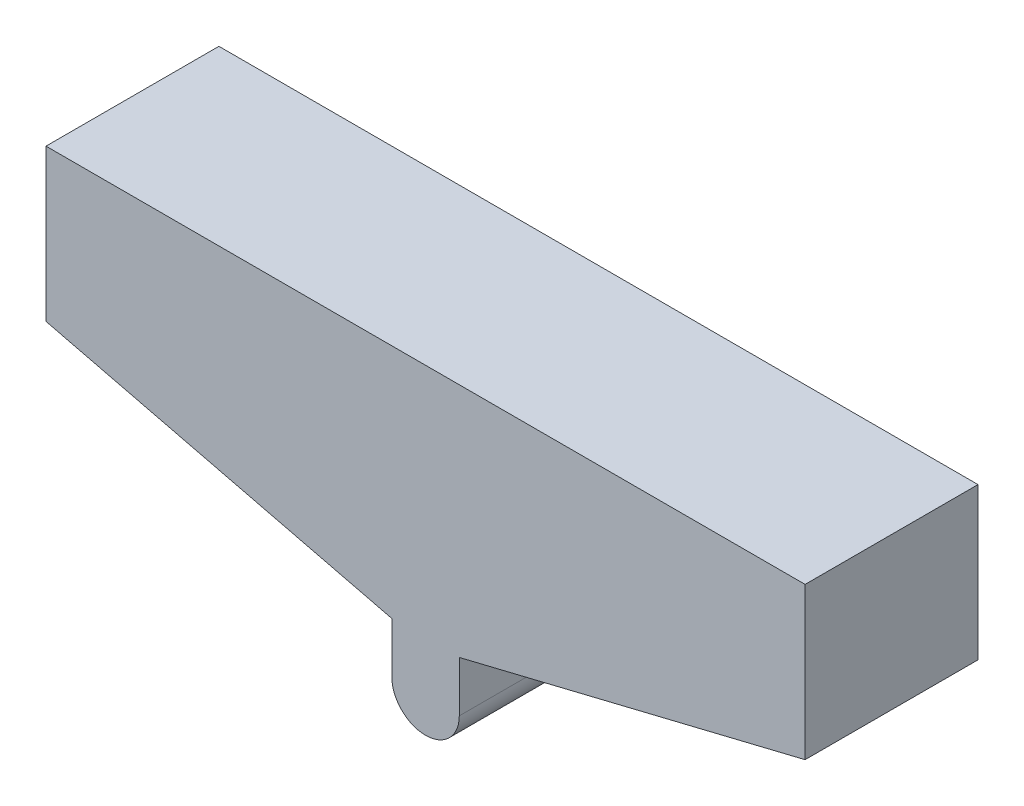
ISO-10303-21;
HEADER;
FILE_DESCRIPTION(('STEP AP214'),'2;1');
FILE_NAME('part.step','',(''),(''),'','','');
FILE_SCHEMA(('AUTOMOTIVE_DESIGN { 1 0 10303 214 1 1 1 1 }'));
ENDSEC;
DATA;
#1=APPLICATION_CONTEXT('core data for automotive mechanical design processes');
#2=APPLICATION_PROTOCOL_DEFINITION('international standard','automotive_design',2000,#1);
#3=PRODUCT_CONTEXT('',#1,'mechanical');
#4=PRODUCT('Part','Part','',(#3));
#5=PRODUCT_RELATED_PRODUCT_CATEGORY('part','',(#4));
#6=PRODUCT_DEFINITION_FORMATION('','',#4);
#7=PRODUCT_DEFINITION_CONTEXT('part definition',#1,'design');
#8=PRODUCT_DEFINITION('design','',#6,#7);
#9=PRODUCT_DEFINITION_SHAPE('','',#8);
#10=(LENGTH_UNIT() NAMED_UNIT(*) SI_UNIT(.MILLI.,.METRE.));
#11=(NAMED_UNIT(*) PLANE_ANGLE_UNIT() SI_UNIT($,.RADIAN.));
#12=(NAMED_UNIT(*) SI_UNIT($,.STERADIAN.) SOLID_ANGLE_UNIT());
#13=UNCERTAINTY_MEASURE_WITH_UNIT(LENGTH_MEASURE(1.E-05),#10,'distance_accuracy_value','');
#14=(GEOMETRIC_REPRESENTATION_CONTEXT(3) GLOBAL_UNCERTAINTY_ASSIGNED_CONTEXT((#13)) GLOBAL_UNIT_ASSIGNED_CONTEXT((#10,
#11,#12)) REPRESENTATION_CONTEXT('',''));
#15=CARTESIAN_POINT('',(0.,0.,0.));
#16=DIRECTION('',(0.,0.,1.));
#17=DIRECTION('',(1.,0.,0.));
#18=AXIS2_PLACEMENT_3D('',#15,#16,#17);
#19=CARTESIAN_POINT('',(0.,0.,0.));
#20=DIRECTION('',(0.,0.,1.));
#21=DIRECTION('',(1.,0.,0.));
#22=AXIS2_PLACEMENT_3D('',#19,#20,#21);
#23=PLANE('',#22);
#24=DIRECTION('',(0.,-1.,0.));
#25=VECTOR('',#24,1.);
#26=CARTESIAN_POINT('',(4.,0.,0.));
#27=LINE('',#26,#25);
#28=CARTESIAN_POINT('',(4.,-9.,0.));
#29=VERTEX_POINT('',#28);
#30=CARTESIAN_POINT('',(4.00000000000001,-19.,0.));
#31=VERTEX_POINT('',#30);
#32=EDGE_CURVE('E210',#29,#31,#27,.T.);
#33=ORIENTED_EDGE('',*,*,#32,.F.);
#34=DIRECTION('',(1.,0.,0.));
#35=VECTOR('',#34,1.);
#36=CARTESIAN_POINT('',(0.,-9.,0.));
#37=LINE('',#36,#35);
#38=CARTESIAN_POINT('',(45.,-9.,0.));
#39=VERTEX_POINT('',#38);
#40=EDGE_CURVE('E206',#29,#39,#37,.T.);
#41=ORIENTED_EDGE('',*,*,#40,.T.);
#42=DIRECTION('',(-0.97152033878313,-0.236956180191007,0.));
#43=VECTOR('',#42,1.);
#44=CARTESIAN_POINT('',(4.5985401459854,-18.8540145985401,0.));
#45=LINE('',#44,#43);
#46=EDGE_CURVE('E294',#39,#31,#45,.T.);
#47=ORIENTED_EDGE('',*,*,#46,.T.);
#48=EDGE_LOOP('',(#33,#41,#47));
#49=FACE_BOUND('',#48,.T.);
#50=ADVANCED_FACE('F41',(#49),#23,.F.);
#51=CARTESIAN_POINT('',(4.,0.,14.));
#52=DIRECTION('',(1.,0.,0.));
#53=DIRECTION('',(0.,1.,0.));
#54=AXIS2_PLACEMENT_3D('',#51,#52,#53);
#55=PLANE('',#54);
#56=DIRECTION('',(0.,-1.,0.));
#57=VECTOR('',#56,1.);
#58=CARTESIAN_POINT('',(4.,0.,14.));
#59=LINE('',#58,#57);
#60=CARTESIAN_POINT('',(4.00000000000001,-19.,14.));
#61=VERTEX_POINT('',#60);
#62=CARTESIAN_POINT('',(4.00000000000001,-25.,14.));
#63=VERTEX_POINT('',#62);
#64=EDGE_CURVE('E325',#61,#63,#59,.T.);
#65=ORIENTED_EDGE('',*,*,#64,.T.);
#66=DIRECTION('',(0.,0.,-1.));
#67=VECTOR('',#66,1.);
#68=CARTESIAN_POINT('',(4.00000000000001,-25.,14.));
#69=LINE('',#68,#67);
#70=CARTESIAN_POINT('',(4.00000000000001,-25.,-6.5));
#71=VERTEX_POINT('',#70);
#72=EDGE_CURVE('E11',#63,#71,#69,.T.);
#73=ORIENTED_EDGE('',*,*,#72,.T.);
#74=DIRECTION('',(0.,-1.,0.));
#75=VECTOR('',#74,1.);
#76=CARTESIAN_POINT('',(4.,0.,-6.5));
#77=LINE('',#76,#75);
#78=CARTESIAN_POINT('',(4.,-9.,-6.5));
#79=VERTEX_POINT('',#78);
#80=EDGE_CURVE('E242',#79,#71,#77,.T.);
#81=ORIENTED_EDGE('',*,*,#80,.F.);
#82=DIRECTION('',(0.,0.,1.));
#83=VECTOR('',#82,1.);
#84=CARTESIAN_POINT('',(4.,-9.,-6.5));
#85=LINE('',#84,#83);
#86=EDGE_CURVE('E298',#79,#29,#85,.T.);
#87=ORIENTED_EDGE('',*,*,#86,.T.);
#88=ORIENTED_EDGE('',*,*,#32,.T.);
#89=DIRECTION('',(0.,0.,-1.));
#90=VECTOR('',#89,1.);
#91=CARTESIAN_POINT('',(4.00000000000001,-19.,14.));
#92=LINE('',#91,#90);
#93=EDGE_CURVE('E375',#61,#31,#92,.T.);
#94=ORIENTED_EDGE('',*,*,#93,.F.);
#95=EDGE_LOOP('',(#65,#73,#81,#87,#88,#94));
#96=FACE_BOUND('',#95,.T.);
#97=ADVANCED_FACE('F414',(#96),#55,.T.);
#98=CARTESIAN_POINT('',(4.5985401459854,-18.8540145985401,14.));
#99=DIRECTION('',(0.236956180191007,-0.97152033878313,0.));
#100=DIRECTION('',(0.97152033878313,0.236956180191007,0.));
#101=AXIS2_PLACEMENT_3D('',#98,#99,#100);
#102=PLANE('',#101);
#103=ORIENTED_EDGE('',*,*,#46,.F.);
#104=DIRECTION('',(0.,0.,-1.));
#105=VECTOR('',#104,1.);
#106=CARTESIAN_POINT('',(45.,-9.,14.));
#107=LINE('',#106,#105);
#108=CARTESIAN_POINT('',(45.,-9.,14.));
#109=VERTEX_POINT('',#108);
#110=EDGE_CURVE('E371',#109,#39,#107,.T.);
#111=ORIENTED_EDGE('',*,*,#110,.F.);
#112=DIRECTION('',(-0.97152033878313,-0.236956180191007,0.));
#113=VECTOR('',#112,1.);
#114=CARTESIAN_POINT('',(4.5985401459854,-18.8540145985401,14.));
#115=LINE('',#114,#113);
#116=EDGE_CURVE('E328',#109,#61,#115,.T.);
#117=ORIENTED_EDGE('',*,*,#116,.T.);
#118=ORIENTED_EDGE('',*,*,#93,.T.);
#119=EDGE_LOOP('',(#103,#111,#117,#118));
#120=FACE_BOUND('',#119,.T.);
#121=ADVANCED_FACE('F410',(#120),#102,.T.);
#122=CARTESIAN_POINT('',(45.,0.,14.));
#123=DIRECTION('',(-1.,0.,0.));
#124=DIRECTION('',(0.,0.,1.));
#125=AXIS2_PLACEMENT_3D('',#122,#123,#124);
#126=PLANE('',#125);
#127=ORIENTED_EDGE('',*,*,#110,.T.);
#128=DIRECTION('',(0.,0.,1.));
#129=VECTOR('',#128,1.);
#130=CARTESIAN_POINT('',(45.,-9.,-6.5));
#131=LINE('',#130,#129);
#132=CARTESIAN_POINT('',(45.,-9.,-6.5));
#133=VERTEX_POINT('',#132);
#134=EDGE_CURVE('E295',#133,#39,#131,.T.);
#135=ORIENTED_EDGE('',*,*,#134,.F.);
#136=DIRECTION('',(0.,1.,0.));
#137=VECTOR('',#136,1.);
#138=CARTESIAN_POINT('',(45.,0.,-6.5));
#139=LINE('',#138,#137);
#140=CARTESIAN_POINT('',(45.,9.00000000000001,-6.5));
#141=VERTEX_POINT('',#140);
#142=EDGE_CURVE('E246',#133,#141,#139,.T.);
#143=ORIENTED_EDGE('',*,*,#142,.T.);
#144=DIRECTION('',(0.,0.,-1.));
#145=VECTOR('',#144,1.);
#146=CARTESIAN_POINT('',(45.,9.00000000000001,14.));
#147=LINE('',#146,#145);
#148=CARTESIAN_POINT('',(45.,9.00000000000001,14.));
#149=VERTEX_POINT('',#148);
#150=EDGE_CURVE('E368',#149,#141,#147,.T.);
#151=ORIENTED_EDGE('',*,*,#150,.F.);
#152=DIRECTION('',(0.,1.,0.));
#153=VECTOR('',#152,1.);
#154=CARTESIAN_POINT('',(45.,0.,14.));
#155=LINE('',#154,#153);
#156=EDGE_CURVE('E333',#109,#149,#155,.T.);
#157=ORIENTED_EDGE('',*,*,#156,.F.);
#158=EDGE_LOOP('',(#127,#135,#143,#151,#157));
#159=FACE_BOUND('',#158,.T.);
#160=ADVANCED_FACE('F405',(#159),#126,.F.);
#161=CARTESIAN_POINT('',(0.,9.00000000000001,14.));
#162=DIRECTION('',(0.,1.,0.));
#163=DIRECTION('',(0.,0.,1.));
#164=AXIS2_PLACEMENT_3D('',#161,#162,#163);
#165=PLANE('',#164);
#166=ORIENTED_EDGE('',*,*,#150,.T.);
#167=DIRECTION('',(1.,0.,0.));
#168=VECTOR('',#167,1.);
#169=CARTESIAN_POINT('',(0.,9.00000000000001,-6.5));
#170=LINE('',#169,#168);
#171=CARTESIAN_POINT('',(-45.,9.00000000000001,-6.5));
#172=VERTEX_POINT('',#171);
#173=EDGE_CURVE('E250',#172,#141,#170,.T.);
#174=ORIENTED_EDGE('',*,*,#173,.F.);
#175=DIRECTION('',(0.,0.,-1.));
#176=VECTOR('',#175,1.);
#177=CARTESIAN_POINT('',(-45.,9.00000000000001,14.));
#178=LINE('',#177,#176);
#179=CARTESIAN_POINT('',(-45.,9.00000000000001,14.));
#180=VERTEX_POINT('',#179);
#181=EDGE_CURVE('E365',#180,#172,#178,.T.);
#182=ORIENTED_EDGE('',*,*,#181,.F.);
#183=DIRECTION('',(1.,0.,0.));
#184=VECTOR('',#183,1.);
#185=CARTESIAN_POINT('',(0.,9.00000000000001,14.));
#186=LINE('',#185,#184);
#187=EDGE_CURVE('E336',#180,#149,#186,.T.);
#188=ORIENTED_EDGE('',*,*,#187,.T.);
#189=EDGE_LOOP('',(#166,#174,#182,#188));
#190=FACE_BOUND('',#189,.T.);
#191=ADVANCED_FACE('F514',(#190),#165,.T.);
#192=CARTESIAN_POINT('',(-45.,0.,14.));
#193=DIRECTION('',(-1.,0.,0.));
#194=DIRECTION('',(0.,0.,1.));
#195=AXIS2_PLACEMENT_3D('',#192,#193,#194);
#196=PLANE('',#195);
#197=ORIENTED_EDGE('',*,*,#181,.T.);
#198=DIRECTION('',(0.,1.,0.));
#199=VECTOR('',#198,1.);
#200=CARTESIAN_POINT('',(-45.,0.,-6.5));
#201=LINE('',#200,#199);
#202=CARTESIAN_POINT('',(-45.,-9.,-6.5));
#203=VERTEX_POINT('',#202);
#204=EDGE_CURVE('E199',#203,#172,#201,.T.);
#205=ORIENTED_EDGE('',*,*,#204,.F.);
#206=DIRECTION('',(0.,0.,1.));
#207=VECTOR('',#206,1.);
#208=CARTESIAN_POINT('',(-45.,-9.,-6.5));
#209=LINE('',#208,#207);
#210=CARTESIAN_POINT('',(-45.,-9.,0.));
#211=VERTEX_POINT('',#210);
#212=EDGE_CURVE('E291',#203,#211,#209,.T.);
#213=ORIENTED_EDGE('',*,*,#212,.T.);
#214=DIRECTION('',(0.,0.,-1.));
#215=VECTOR('',#214,1.);
#216=CARTESIAN_POINT('',(-45.,-9.,14.));
#217=LINE('',#216,#215);
#218=CARTESIAN_POINT('',(-45.,-9.,14.));
#219=VERTEX_POINT('',#218);
#220=EDGE_CURVE('E361',#219,#211,#217,.T.);
#221=ORIENTED_EDGE('',*,*,#220,.F.);
#222=DIRECTION('',(0.,1.,0.));
#223=VECTOR('',#222,1.);
#224=CARTESIAN_POINT('',(-45.,0.,14.));
#225=LINE('',#224,#223);
#226=EDGE_CURVE('E340',#219,#180,#225,.T.);
#227=ORIENTED_EDGE('',*,*,#226,.T.);
#228=EDGE_LOOP('',(#197,#205,#213,#221,#227));
#229=FACE_BOUND('',#228,.T.);
#230=ADVANCED_FACE('F511',(#229),#196,.T.);
#231=CARTESIAN_POINT('',(-4.5985401459854,-18.8540145985401,14.));
#232=DIRECTION('',(-0.236956180191007,-0.97152033878313,0.));
#233=DIRECTION('',(0.97152033878313,-0.236956180191007,0.));
#234=AXIS2_PLACEMENT_3D('',#231,#232,#233);
#235=PLANE('',#234);
#236=DIRECTION('',(-0.97152033878313,0.236956180191007,0.));
#237=VECTOR('',#236,1.);
#238=CARTESIAN_POINT('',(-4.5985401459854,-18.8540145985401,0.));
#239=LINE('',#238,#237);
#240=CARTESIAN_POINT('',(-3.99999999999999,-19.,0.));
#241=VERTEX_POINT('',#240);
#242=EDGE_CURVE('E329',#241,#211,#239,.T.);
#243=ORIENTED_EDGE('',*,*,#242,.F.);
#244=DIRECTION('',(0.,0.,-1.));
#245=VECTOR('',#244,1.);
#246=CARTESIAN_POINT('',(-3.99999999999999,-19.,14.));
#247=LINE('',#246,#245);
#248=CARTESIAN_POINT('',(-3.99999999999999,-19.,14.));
#249=VERTEX_POINT('',#248);
#250=EDGE_CURVE('E351',#249,#241,#247,.T.);
#251=ORIENTED_EDGE('',*,*,#250,.F.);
#252=DIRECTION('',(-0.97152033878313,0.236956180191007,0.));
#253=VECTOR('',#252,1.);
#254=CARTESIAN_POINT('',(-4.5985401459854,-18.8540145985401,14.));
#255=LINE('',#254,#253);
#256=EDGE_CURVE('E344',#249,#219,#255,.T.);
#257=ORIENTED_EDGE('',*,*,#256,.T.);
#258=ORIENTED_EDGE('',*,*,#220,.T.);
#259=EDGE_LOOP('',(#243,#251,#257,#258));
#260=FACE_BOUND('',#259,.T.);
#261=ADVANCED_FACE('F502',(#260),#235,.T.);
#262=CARTESIAN_POINT('',(-4.,0.,14.));
#263=DIRECTION('',(1.,0.,0.));
#264=DIRECTION('',(0.,1.,0.));
#265=AXIS2_PLACEMENT_3D('',#262,#263,#264);
#266=PLANE('',#265);
#267=DIRECTION('',(0.,-1.,0.));
#268=VECTOR('',#267,1.);
#269=CARTESIAN_POINT('',(-4.,0.,-6.5));
#270=LINE('',#269,#268);
#271=CARTESIAN_POINT('',(-4.,-9.,-6.5));
#272=VERTEX_POINT('',#271);
#273=CARTESIAN_POINT('',(-3.99999999999999,-25.,-6.5));
#274=VERTEX_POINT('',#273);
#275=EDGE_CURVE('E237',#272,#274,#270,.T.);
#276=ORIENTED_EDGE('',*,*,#275,.T.);
#277=DIRECTION('',(0.,0.,-1.));
#278=VECTOR('',#277,1.);
#279=CARTESIAN_POINT('',(-3.99999999999999,-25.,14.));
#280=LINE('',#279,#278);
#281=CARTESIAN_POINT('',(-3.99999999999999,-25.,14.));
#282=VERTEX_POINT('',#281);
#283=EDGE_CURVE('E385',#274,#282,#280,.F.);
#284=ORIENTED_EDGE('',*,*,#283,.T.);
#285=DIRECTION('',(0.,-1.,0.));
#286=VECTOR('',#285,1.);
#287=CARTESIAN_POINT('',(-4.,0.,14.));
#288=LINE('',#287,#286);
#289=EDGE_CURVE('E348',#249,#282,#288,.T.);
#290=ORIENTED_EDGE('',*,*,#289,.F.);
#291=ORIENTED_EDGE('',*,*,#250,.T.);
#292=DIRECTION('',(0.,-1.,0.));
#293=VECTOR('',#292,1.);
#294=CARTESIAN_POINT('',(-4.,0.,0.));
#295=LINE('',#294,#293);
#296=CARTESIAN_POINT('',(-4.,-9.,0.));
#297=VERTEX_POINT('',#296);
#298=EDGE_CURVE('E286',#297,#241,#295,.T.);
#299=ORIENTED_EDGE('',*,*,#298,.F.);
#300=DIRECTION('',(0.,0.,1.));
#301=VECTOR('',#300,1.);
#302=CARTESIAN_POINT('',(-4.,-9.,-6.5));
#303=LINE('',#302,#301);
#304=EDGE_CURVE('E301',#272,#297,#303,.T.);
#305=ORIENTED_EDGE('',*,*,#304,.F.);
#306=EDGE_LOOP('',(#276,#284,#290,#291,#299,#305));
#307=FACE_BOUND('',#306,.T.);
#308=ADVANCED_FACE('F425',(#307),#266,.F.);
#309=CARTESIAN_POINT('',(0.,0.,14.));
#310=DIRECTION('',(0.,0.,1.));
#311=DIRECTION('',(1.,0.,0.));
#312=AXIS2_PLACEMENT_3D('',#309,#310,#311);
#313=PLANE('',#312);
#314=ORIENTED_EDGE('',*,*,#289,.T.);
#315=CARTESIAN_POINT('',(0.,-25.,14.));
#316=DIRECTION('',(0.,0.,1.));
#317=DIRECTION('',(1.,0.,0.));
#318=AXIS2_PLACEMENT_3D('',#315,#316,#317);
#319=CIRCLE('',#318,4.);
#320=CARTESIAN_POINT('',(0.,-29.,14.));
#321=VERTEX_POINT('',#320);
#322=EDGE_CURVE('E51',#282,#321,#319,.T.);
#323=ORIENTED_EDGE('',*,*,#322,.T.);
#324=CARTESIAN_POINT('',(0.,-25.,14.));
#325=DIRECTION('',(0.,0.,1.));
#326=DIRECTION('',(1.,0.,0.));
#327=AXIS2_PLACEMENT_3D('',#324,#325,#326);
#328=CIRCLE('',#327,4.);
#329=EDGE_CURVE('E61',#321,#63,#328,.T.);
#330=ORIENTED_EDGE('',*,*,#329,.T.);
#331=ORIENTED_EDGE('',*,*,#64,.F.);
#332=ORIENTED_EDGE('',*,*,#116,.F.);
#333=ORIENTED_EDGE('',*,*,#156,.T.);
#334=ORIENTED_EDGE('',*,*,#187,.F.);
#335=ORIENTED_EDGE('',*,*,#226,.F.);
#336=ORIENTED_EDGE('',*,*,#256,.F.);
#337=EDGE_LOOP('',(#314,#323,#330,#331,#332,#333,#334,#335,#336));
#338=FACE_BOUND('',#337,.T.);
#339=ADVANCED_FACE('F447',(#338),#313,.T.);
#340=ORIENTED_EDGE('',*,*,#242,.T.);
#341=EDGE_CURVE('E212',#211,#297,#37,.T.);
#342=ORIENTED_EDGE('',*,*,#341,.T.);
#343=ORIENTED_EDGE('',*,*,#298,.T.);
#344=EDGE_LOOP('',(#340,#342,#343));
#345=FACE_BOUND('',#344,.T.);
#346=ADVANCED_FACE('F438',(#345),#23,.F.);
#347=CARTESIAN_POINT('',(0.,-9.,-6.5));
#348=DIRECTION('',(0.,-1.,0.));
#349=DIRECTION('',(0.,0.,-1.));
#350=AXIS2_PLACEMENT_3D('',#347,#348,#349);
#351=PLANE('',#350);
#352=ORIENTED_EDGE('',*,*,#341,.F.);
#353=ORIENTED_EDGE('',*,*,#212,.F.);
#354=DIRECTION('',(1.,0.,0.));
#355=VECTOR('',#354,1.);
#356=CARTESIAN_POINT('',(0.,-9.,-6.5));
#357=LINE('',#356,#355);
#358=EDGE_CURVE('E233',#203,#272,#357,.T.);
#359=ORIENTED_EDGE('',*,*,#358,.T.);
#360=ORIENTED_EDGE('',*,*,#304,.T.);
#361=EDGE_LOOP('',(#352,#353,#359,#360));
#362=FACE_BOUND('',#361,.T.);
#363=ADVANCED_FACE('F446',(#362),#351,.T.);
#364=ORIENTED_EDGE('',*,*,#40,.F.);
#365=ORIENTED_EDGE('',*,*,#86,.F.);
#366=EDGE_CURVE('E238',#79,#133,#357,.T.);
#367=ORIENTED_EDGE('',*,*,#366,.T.);
#368=ORIENTED_EDGE('',*,*,#134,.T.);
#369=EDGE_LOOP('',(#364,#365,#367,#368));
#370=FACE_BOUND('',#369,.T.);
#371=ADVANCED_FACE('F397',(#370),#351,.T.);
#372=CARTESIAN_POINT('',(-7.5,0.,-6.5));
#373=DIRECTION('',(1.,0.,0.));
#374=DIRECTION('',(0.,0.,-1.));
#375=AXIS2_PLACEMENT_3D('',#372,#373,#374);
#376=PLANE('',#375);
#377=DIRECTION('',(0.,1.,0.));
#378=VECTOR('',#377,1.);
#379=CARTESIAN_POINT('',(-7.5,0.,0.));
#380=LINE('',#379,#378);
#381=CARTESIAN_POINT('',(-7.5,-2.99999999999999,0.));
#382=VERTEX_POINT('',#381);
#383=CARTESIAN_POINT('',(-7.5,3.00000000000001,0.));
#384=VERTEX_POINT('',#383);
#385=EDGE_CURVE('E270',#382,#384,#380,.T.);
#386=ORIENTED_EDGE('',*,*,#385,.T.);
#387=DIRECTION('',(0.,0.,1.));
#388=VECTOR('',#387,1.);
#389=CARTESIAN_POINT('',(-7.5,3.00000000000001,-6.5));
#390=LINE('',#389,#388);
#391=CARTESIAN_POINT('',(-7.5,3.00000000000001,-6.5));
#392=VERTEX_POINT('',#391);
#393=EDGE_CURVE('E304',#392,#384,#390,.T.);
#394=ORIENTED_EDGE('',*,*,#393,.F.);
#395=DIRECTION('',(0.,1.,0.));
#396=VECTOR('',#395,1.);
#397=CARTESIAN_POINT('',(-7.5,0.,-6.5));
#398=LINE('',#397,#396);
#399=CARTESIAN_POINT('',(-7.5,-2.99999999999999,-6.5));
#400=VERTEX_POINT('',#399);
#401=EDGE_CURVE('E219',#400,#392,#398,.T.);
#402=ORIENTED_EDGE('',*,*,#401,.F.);
#403=DIRECTION('',(0.,0.,1.));
#404=VECTOR('',#403,1.);
#405=CARTESIAN_POINT('',(-7.5,-2.99999999999999,-6.5));
#406=LINE('',#405,#404);
#407=EDGE_CURVE('E314',#400,#382,#406,.T.);
#408=ORIENTED_EDGE('',*,*,#407,.T.);
#409=EDGE_LOOP('',(#386,#394,#402,#408));
#410=FACE_BOUND('',#409,.T.);
#411=ADVANCED_FACE('F462',(#410),#376,.F.);
#412=CARTESIAN_POINT('',(0.,3.00000000000001,-6.5));
#413=DIRECTION('',(0.,-1.,0.));
#414=DIRECTION('',(0.,0.,-1.));
#415=AXIS2_PLACEMENT_3D('',#412,#413,#414);
#416=PLANE('',#415);
#417=DIRECTION('',(1.,0.,0.));
#418=VECTOR('',#417,1.);
#419=CARTESIAN_POINT('',(0.,3.00000000000001,0.));
#420=LINE('',#419,#418);
#421=CARTESIAN_POINT('',(-22.5,3.00000000000001,0.));
#422=VERTEX_POINT('',#421);
#423=EDGE_CURVE('E280',#422,#384,#420,.T.);
#424=ORIENTED_EDGE('',*,*,#423,.F.);
#425=DIRECTION('',(0.,0.,1.));
#426=VECTOR('',#425,1.);
#427=CARTESIAN_POINT('',(-22.5,3.00000000000001,-6.5));
#428=LINE('',#427,#426);
#429=CARTESIAN_POINT('',(-22.5,3.00000000000001,-6.5));
#430=VERTEX_POINT('',#429);
#431=EDGE_CURVE('E308',#430,#422,#428,.T.);
#432=ORIENTED_EDGE('',*,*,#431,.F.);
#433=DIRECTION('',(1.,0.,0.));
#434=VECTOR('',#433,1.);
#435=CARTESIAN_POINT('',(0.,3.00000000000001,-6.5));
#436=LINE('',#435,#434);
#437=EDGE_CURVE('E229',#430,#392,#436,.T.);
#438=ORIENTED_EDGE('',*,*,#437,.T.);
#439=ORIENTED_EDGE('',*,*,#393,.T.);
#440=EDGE_LOOP('',(#424,#432,#438,#439));
#441=FACE_BOUND('',#440,.T.);
#442=ADVANCED_FACE('F466',(#441),#416,.T.);
#443=CARTESIAN_POINT('',(-22.5,0.,-6.5));
#444=DIRECTION('',(1.,0.,0.));
#445=DIRECTION('',(0.,0.,-1.));
#446=AXIS2_PLACEMENT_3D('',#443,#444,#445);
#447=PLANE('',#446);
#448=DIRECTION('',(0.,1.,0.));
#449=VECTOR('',#448,1.);
#450=CARTESIAN_POINT('',(-22.5,0.,0.));
#451=LINE('',#450,#449);
#452=CARTESIAN_POINT('',(-22.5,-2.99999999999999,0.));
#453=VERTEX_POINT('',#452);
#454=EDGE_CURVE('E276',#453,#422,#451,.T.);
#455=ORIENTED_EDGE('',*,*,#454,.F.);
#456=DIRECTION('',(0.,0.,1.));
#457=VECTOR('',#456,1.);
#458=CARTESIAN_POINT('',(-22.5,-2.99999999999999,-6.5));
#459=LINE('',#458,#457);
#460=CARTESIAN_POINT('',(-22.5,-2.99999999999999,-6.5));
#461=VERTEX_POINT('',#460);
#462=EDGE_CURVE('E311',#461,#453,#459,.T.);
#463=ORIENTED_EDGE('',*,*,#462,.F.);
#464=DIRECTION('',(0.,1.,0.));
#465=VECTOR('',#464,1.);
#466=CARTESIAN_POINT('',(-22.5,0.,-6.5));
#467=LINE('',#466,#465);
#468=EDGE_CURVE('E225',#461,#430,#467,.T.);
#469=ORIENTED_EDGE('',*,*,#468,.T.);
#470=ORIENTED_EDGE('',*,*,#431,.T.);
#471=EDGE_LOOP('',(#455,#463,#469,#470));
#472=FACE_BOUND('',#471,.T.);
#473=ADVANCED_FACE('F474',(#472),#447,.T.);
#474=CARTESIAN_POINT('',(22.5,0.,-6.5));
#475=DIRECTION('',(1.,0.,0.));
#476=DIRECTION('',(0.,0.,-1.));
#477=AXIS2_PLACEMENT_3D('',#474,#475,#476);
#478=PLANE('',#477);
#479=DIRECTION('',(0.,1.,0.));
#480=VECTOR('',#479,1.);
#481=CARTESIAN_POINT('',(22.5,0.,0.));
#482=LINE('',#481,#480);
#483=CARTESIAN_POINT('',(22.5,-2.99999999999999,0.));
#484=VERTEX_POINT('',#483);
#485=CARTESIAN_POINT('',(22.5,3.00000000000001,0.));
#486=VERTEX_POINT('',#485);
#487=EDGE_CURVE('E257',#484,#486,#482,.T.);
#488=ORIENTED_EDGE('',*,*,#487,.T.);
#489=DIRECTION('',(0.,0.,1.));
#490=VECTOR('',#489,1.);
#491=CARTESIAN_POINT('',(22.5,3.00000000000001,-6.5));
#492=LINE('',#491,#490);
#493=CARTESIAN_POINT('',(22.5,3.00000000000001,-6.5));
#494=VERTEX_POINT('',#493);
#495=EDGE_CURVE('E203',#494,#486,#492,.T.);
#496=ORIENTED_EDGE('',*,*,#495,.F.);
#497=DIRECTION('',(0.,1.,0.));
#498=VECTOR('',#497,1.);
#499=CARTESIAN_POINT('',(22.5,0.,-6.5));
#500=LINE('',#499,#498);
#501=CARTESIAN_POINT('',(22.5,-2.99999999999999,-6.5));
#502=VERTEX_POINT('',#501);
#503=EDGE_CURVE('E183',#502,#494,#500,.T.);
#504=ORIENTED_EDGE('',*,*,#503,.F.);
#505=DIRECTION('',(0.,0.,1.));
#506=VECTOR('',#505,1.);
#507=CARTESIAN_POINT('',(22.5,-2.99999999999999,-6.5));
#508=LINE('',#507,#506);
#509=EDGE_CURVE('E191',#502,#484,#508,.T.);
#510=ORIENTED_EDGE('',*,*,#509,.T.);
#511=EDGE_LOOP('',(#488,#496,#504,#510));
#512=FACE_BOUND('',#511,.T.);
#513=ADVANCED_FACE('F201',(#512),#478,.F.);
#514=CARTESIAN_POINT('',(0.,3.00000000000001,-6.5));
#515=DIRECTION('',(0.,-1.,0.));
#516=DIRECTION('',(0.,0.,-1.));
#517=AXIS2_PLACEMENT_3D('',#514,#515,#516);
#518=PLANE('',#517);
#519=DIRECTION('',(1.,0.,0.));
#520=VECTOR('',#519,1.);
#521=CARTESIAN_POINT('',(0.,3.00000000000001,0.));
#522=LINE('',#521,#520);
#523=CARTESIAN_POINT('',(7.5,3.00000000000001,0.));
#524=VERTEX_POINT('',#523);
#525=EDGE_CURVE('E266',#524,#486,#522,.T.);
#526=ORIENTED_EDGE('',*,*,#525,.F.);
#527=DIRECTION('',(0.,0.,1.));
#528=VECTOR('',#527,1.);
#529=CARTESIAN_POINT('',(7.5,3.00000000000001,-6.5));
#530=LINE('',#529,#528);
#531=CARTESIAN_POINT('',(7.5,3.00000000000001,-6.5));
#532=VERTEX_POINT('',#531);
#533=EDGE_CURVE('E320',#532,#524,#530,.T.);
#534=ORIENTED_EDGE('',*,*,#533,.F.);
#535=DIRECTION('',(1.,0.,0.));
#536=VECTOR('',#535,1.);
#537=CARTESIAN_POINT('',(0.,3.00000000000001,-6.5));
#538=LINE('',#537,#536);
#539=EDGE_CURVE('E216',#532,#494,#538,.T.);
#540=ORIENTED_EDGE('',*,*,#539,.T.);
#541=ORIENTED_EDGE('',*,*,#495,.T.);
#542=EDGE_LOOP('',(#526,#534,#540,#541));
#543=FACE_BOUND('',#542,.T.);
#544=ADVANCED_FACE('F481',(#543),#518,.T.);
#545=CARTESIAN_POINT('',(7.5,0.,-6.5));
#546=DIRECTION('',(1.,0.,0.));
#547=DIRECTION('',(0.,0.,-1.));
#548=AXIS2_PLACEMENT_3D('',#545,#546,#547);
#549=PLANE('',#548);
#550=DIRECTION('',(0.,1.,0.));
#551=VECTOR('',#550,1.);
#552=CARTESIAN_POINT('',(7.5,0.,0.));
#553=LINE('',#552,#551);
#554=CARTESIAN_POINT('',(7.5,-2.99999999999999,0.));
#555=VERTEX_POINT('',#554);
#556=EDGE_CURVE('E262',#555,#524,#553,.T.);
#557=ORIENTED_EDGE('',*,*,#556,.F.);
#558=DIRECTION('',(0.,0.,1.));
#559=VECTOR('',#558,1.);
#560=CARTESIAN_POINT('',(7.5,-2.99999999999999,-6.5));
#561=LINE('',#560,#559);
#562=CARTESIAN_POINT('',(7.5,-2.99999999999999,-6.5));
#563=VERTEX_POINT('',#562);
#564=EDGE_CURVE('E198',#563,#555,#561,.T.);
#565=ORIENTED_EDGE('',*,*,#564,.F.);
#566=DIRECTION('',(0.,1.,0.));
#567=VECTOR('',#566,1.);
#568=CARTESIAN_POINT('',(7.5,0.,-6.5));
#569=LINE('',#568,#567);
#570=EDGE_CURVE('E186',#563,#532,#569,.T.);
#571=ORIENTED_EDGE('',*,*,#570,.T.);
#572=ORIENTED_EDGE('',*,*,#533,.T.);
#573=EDGE_LOOP('',(#557,#565,#571,#572));
#574=FACE_BOUND('',#573,.T.);
#575=ADVANCED_FACE('F488',(#574),#549,.T.);
#576=CARTESIAN_POINT('',(0.,-2.99999999999999,-6.5));
#577=DIRECTION('',(0.,-1.,0.));
#578=DIRECTION('',(0.,0.,-1.));
#579=AXIS2_PLACEMENT_3D('',#576,#577,#578);
#580=PLANE('',#579);
#581=DIRECTION('',(1.,0.,0.));
#582=VECTOR('',#581,1.);
#583=CARTESIAN_POINT('',(0.,-2.99999999999999,0.));
#584=LINE('',#583,#582);
#585=EDGE_CURVE('E273',#453,#382,#584,.T.);
#586=ORIENTED_EDGE('',*,*,#585,.T.);
#587=ORIENTED_EDGE('',*,*,#407,.F.);
#588=DIRECTION('',(1.,0.,0.));
#589=VECTOR('',#588,1.);
#590=CARTESIAN_POINT('',(0.,-2.99999999999999,-6.5));
#591=LINE('',#590,#589);
#592=EDGE_CURVE('E222',#461,#400,#591,.T.);
#593=ORIENTED_EDGE('',*,*,#592,.F.);
#594=ORIENTED_EDGE('',*,*,#462,.T.);
#595=EDGE_LOOP('',(#586,#587,#593,#594));
#596=FACE_BOUND('',#595,.T.);
#597=ADVANCED_FACE('F471',(#596),#580,.F.);
#598=CARTESIAN_POINT('',(0.,-2.99999999999999,-6.5));
#599=DIRECTION('',(0.,-1.,0.));
#600=DIRECTION('',(0.,0.,-1.));
#601=AXIS2_PLACEMENT_3D('',#598,#599,#600);
#602=PLANE('',#601);
#603=DIRECTION('',(1.,0.,0.));
#604=VECTOR('',#603,1.);
#605=CARTESIAN_POINT('',(0.,-2.99999999999999,0.));
#606=LINE('',#605,#604);
#607=EDGE_CURVE('E194',#555,#484,#606,.T.);
#608=ORIENTED_EDGE('',*,*,#607,.T.);
#609=ORIENTED_EDGE('',*,*,#509,.F.);
#610=DIRECTION('',(1.,0.,0.));
#611=VECTOR('',#610,1.);
#612=CARTESIAN_POINT('',(0.,-2.99999999999999,-6.5));
#613=LINE('',#612,#611);
#614=EDGE_CURVE('E177',#563,#502,#613,.T.);
#615=ORIENTED_EDGE('',*,*,#614,.F.);
#616=ORIENTED_EDGE('',*,*,#564,.T.);
#617=EDGE_LOOP('',(#608,#609,#615,#616));
#618=FACE_BOUND('',#617,.T.);
#619=ADVANCED_FACE('F192',(#618),#602,.F.);
#620=CARTESIAN_POINT('',(0.,0.,-6.5));
#621=DIRECTION('',(0.,0.,1.));
#622=DIRECTION('',(1.,0.,0.));
#623=AXIS2_PLACEMENT_3D('',#620,#621,#622);
#624=PLANE('',#623);
#625=ORIENTED_EDGE('',*,*,#503,.T.);
#626=ORIENTED_EDGE('',*,*,#539,.F.);
#627=ORIENTED_EDGE('',*,*,#570,.F.);
#628=ORIENTED_EDGE('',*,*,#614,.T.);
#629=EDGE_LOOP('',(#625,#626,#627,#628));
#630=FACE_BOUND('',#629,.T.);
#631=ORIENTED_EDGE('',*,*,#401,.T.);
#632=ORIENTED_EDGE('',*,*,#437,.F.);
#633=ORIENTED_EDGE('',*,*,#468,.F.);
#634=ORIENTED_EDGE('',*,*,#592,.T.);
#635=EDGE_LOOP('',(#631,#632,#633,#634));
#636=FACE_BOUND('',#635,.T.);
#637=CARTESIAN_POINT('',(0.,-25.,-6.5));
#638=DIRECTION('',(0.,0.,1.));
#639=DIRECTION('',(1.,0.,0.));
#640=AXIS2_PLACEMENT_3D('',#637,#638,#639);
#641=CIRCLE('',#640,4.);
#642=CARTESIAN_POINT('',(0.,-29.,-6.5));
#643=VERTEX_POINT('',#642);
#644=EDGE_CURVE('E379',#71,#643,#641,.F.);
#645=ORIENTED_EDGE('',*,*,#644,.T.);
#646=CARTESIAN_POINT('',(0.,-25.,-6.5));
#647=DIRECTION('',(0.,0.,1.));
#648=DIRECTION('',(1.,0.,0.));
#649=AXIS2_PLACEMENT_3D('',#646,#647,#648);
#650=CIRCLE('',#649,4.);
#651=EDGE_CURVE('E382',#643,#274,#650,.F.);
#652=ORIENTED_EDGE('',*,*,#651,.T.);
#653=ORIENTED_EDGE('',*,*,#275,.F.);
#654=ORIENTED_EDGE('',*,*,#358,.F.);
#655=ORIENTED_EDGE('',*,*,#204,.T.);
#656=ORIENTED_EDGE('',*,*,#173,.T.);
#657=ORIENTED_EDGE('',*,*,#142,.F.);
#658=ORIENTED_EDGE('',*,*,#366,.F.);
#659=ORIENTED_EDGE('',*,*,#80,.T.);
#660=EDGE_LOOP('',(#645,#652,#653,#654,#655,#656,#657,#658,#659));
#661=FACE_BOUND('',#660,.T.);
#662=ADVANCED_FACE('F179',(#630,#636,#661),#624,.F.);
#663=ORIENTED_EDGE('',*,*,#385,.F.);
#664=ORIENTED_EDGE('',*,*,#585,.F.);
#665=ORIENTED_EDGE('',*,*,#454,.T.);
#666=ORIENTED_EDGE('',*,*,#423,.T.);
#667=EDGE_LOOP('',(#663,#664,#665,#666));
#668=FACE_BOUND('',#667,.T.);
#669=ADVANCED_FACE('F439',(#668),#23,.F.);
#670=ORIENTED_EDGE('',*,*,#487,.F.);
#671=ORIENTED_EDGE('',*,*,#607,.F.);
#672=ORIENTED_EDGE('',*,*,#556,.T.);
#673=ORIENTED_EDGE('',*,*,#525,.T.);
#674=EDGE_LOOP('',(#670,#671,#672,#673));
#675=FACE_BOUND('',#674,.T.);
#676=ADVANCED_FACE('F434',(#675),#23,.F.);
#677=CARTESIAN_POINT('',(0.,-25.,14.));
#678=DIRECTION('',(0.,0.,-1.));
#679=DIRECTION('',(-1.,0.,0.));
#680=AXIS2_PLACEMENT_3D('',#677,#678,#679);
#681=CYLINDRICAL_SURFACE('',#680,4.);
#682=ORIENTED_EDGE('',*,*,#72,.F.);
#683=ORIENTED_EDGE('',*,*,#329,.F.);
#684=DIRECTION('',(0.,0.,-1.));
#685=VECTOR('',#684,1.);
#686=CARTESIAN_POINT('',(0.,-29.,14.));
#687=LINE('',#686,#685);
#688=EDGE_CURVE('E45',#643,#321,#687,.F.);
#689=ORIENTED_EDGE('',*,*,#688,.F.);
#690=ORIENTED_EDGE('',*,*,#644,.F.);
#691=EDGE_LOOP('',(#682,#683,#689,#690));
#692=FACE_BOUND('',#691,.T.);
#693=ADVANCED_FACE('F43',(#692),#681,.T.);
#694=CARTESIAN_POINT('',(0.,-25.,14.));
#695=DIRECTION('',(0.,0.,1.));
#696=DIRECTION('',(1.,0.,0.));
#697=AXIS2_PLACEMENT_3D('',#694,#695,#696);
#698=CYLINDRICAL_SURFACE('',#697,4.);
#699=ORIENTED_EDGE('',*,*,#322,.F.);
#700=ORIENTED_EDGE('',*,*,#283,.F.);
#701=ORIENTED_EDGE('',*,*,#651,.F.);
#702=ORIENTED_EDGE('',*,*,#688,.T.);
#703=EDGE_LOOP('',(#699,#700,#701,#702));
#704=FACE_BOUND('',#703,.T.);
#705=ADVANCED_FACE('F428',(#704),#698,.T.);
#706=CLOSED_SHELL('',(#50,#97,#121,#160,#191,#230,#261,#308,#339,#346,#363,#371,#411,#442,#473,
#513,#544,#575,#597,#619,#662,#669,#676,#693,#705));
#707=MANIFOLD_SOLID_BREP('B2',#706);
#708=ADVANCED_BREP_SHAPE_REPRESENTATION('',(#18,#707),#14);
#709=SHAPE_DEFINITION_REPRESENTATION(#9,#708);
ENDSEC;
END-ISO-10303-21;
